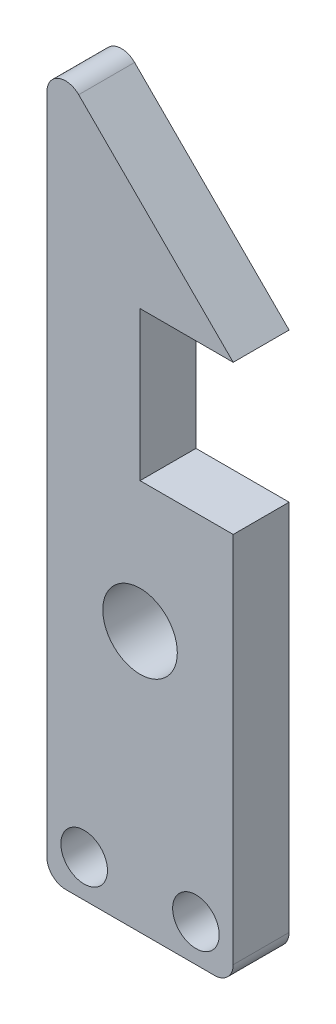
ISO-10303-21;
HEADER;
FILE_DESCRIPTION(('STEP AP214'),'2;1');
FILE_NAME('part.step','',(''),(''),'','','');
FILE_SCHEMA(('AUTOMOTIVE_DESIGN { 1 0 10303 214 1 1 1 1 }'));
ENDSEC;
DATA;
#1=APPLICATION_CONTEXT('core data for automotive mechanical design processes');
#2=APPLICATION_PROTOCOL_DEFINITION('international standard','automotive_design',2000,#1);
#3=PRODUCT_CONTEXT('',#1,'mechanical');
#4=PRODUCT('Part','Part','',(#3));
#5=PRODUCT_RELATED_PRODUCT_CATEGORY('part','',(#4));
#6=PRODUCT_DEFINITION_FORMATION('','',#4);
#7=PRODUCT_DEFINITION_CONTEXT('part definition',#1,'design');
#8=PRODUCT_DEFINITION('design','',#6,#7);
#9=PRODUCT_DEFINITION_SHAPE('','',#8);
#10=(LENGTH_UNIT() NAMED_UNIT(*) SI_UNIT(.MILLI.,.METRE.));
#11=(NAMED_UNIT(*) PLANE_ANGLE_UNIT() SI_UNIT($,.RADIAN.));
#12=(NAMED_UNIT(*) SI_UNIT($,.STERADIAN.) SOLID_ANGLE_UNIT());
#13=UNCERTAINTY_MEASURE_WITH_UNIT(LENGTH_MEASURE(1.E-05),#10,'distance_accuracy_value','');
#14=(GEOMETRIC_REPRESENTATION_CONTEXT(3) GLOBAL_UNCERTAINTY_ASSIGNED_CONTEXT((#13)) GLOBAL_UNIT_ASSIGNED_CONTEXT((#10,
#11,#12)) REPRESENTATION_CONTEXT('',''));
#15=CARTESIAN_POINT('',(0.,0.,0.));
#16=DIRECTION('',(0.,0.,1.));
#17=DIRECTION('',(1.,0.,0.));
#18=AXIS2_PLACEMENT_3D('',#15,#16,#17);
#19=CARTESIAN_POINT('',(0.,0.,3.));
#20=DIRECTION('',(0.,0.,-1.));
#21=DIRECTION('',(-1.,0.,0.));
#22=AXIS2_PLACEMENT_3D('',#19,#20,#21);
#23=PLANE('',#22);
#24=DIRECTION('',(-0.707106781186552,0.707106781186544,0.));
#25=VECTOR('',#24,1.);
#26=CARTESIAN_POINT('',(10.,29.,3.));
#27=LINE('',#26,#25);
#28=CARTESIAN_POINT('',(10.,29.,3.));
#29=VERTEX_POINT('',#28);
#30=CARTESIAN_POINT('',(1.70710678118654,37.2928932188134,3.));
#31=VERTEX_POINT('',#30);
#32=EDGE_CURVE('E141',#29,#31,#27,.T.);
#33=ORIENTED_EDGE('',*,*,#32,.T.);
#34=CARTESIAN_POINT('',(1.,36.5857864376268,3.));
#35=DIRECTION('',(0.,0.,-1.));
#36=DIRECTION('',(-1.,0.,0.));
#37=AXIS2_PLACEMENT_3D('',#34,#35,#36);
#38=CIRCLE('',#37,1.);
#39=CARTESIAN_POINT('',(0.,36.5857864376268,3.));
#40=VERTEX_POINT('',#39);
#41=EDGE_CURVE('E182',#31,#40,#38,.F.);
#42=ORIENTED_EDGE('',*,*,#41,.T.);
#43=DIRECTION('',(0.,-1.,0.));
#44=VECTOR('',#43,1.);
#45=CARTESIAN_POINT('',(0.,0.,3.));
#46=LINE('',#45,#44);
#47=CARTESIAN_POINT('',(0.,1.,3.));
#48=VERTEX_POINT('',#47);
#49=EDGE_CURVE('E160',#40,#48,#46,.T.);
#50=ORIENTED_EDGE('',*,*,#49,.T.);
#51=CARTESIAN_POINT('',(1.,1.,3.));
#52=DIRECTION('',(0.,0.,-1.));
#53=DIRECTION('',(-1.,0.,0.));
#54=AXIS2_PLACEMENT_3D('',#51,#52,#53);
#55=CIRCLE('',#54,1.);
#56=CARTESIAN_POINT('',(1.,0.,3.));
#57=VERTEX_POINT('',#56);
#58=EDGE_CURVE('E179',#48,#57,#55,.F.);
#59=ORIENTED_EDGE('',*,*,#58,.T.);
#60=DIRECTION('',(1.,0.,0.));
#61=VECTOR('',#60,1.);
#62=CARTESIAN_POINT('',(0.,0.,3.));
#63=LINE('',#62,#61);
#64=CARTESIAN_POINT('',(9.,0.,3.));
#65=VERTEX_POINT('',#64);
#66=EDGE_CURVE('E119',#57,#65,#63,.T.);
#67=ORIENTED_EDGE('',*,*,#66,.T.);
#68=CARTESIAN_POINT('',(9.,1.,3.));
#69=DIRECTION('',(0.,0.,-1.));
#70=DIRECTION('',(-1.,0.,0.));
#71=AXIS2_PLACEMENT_3D('',#68,#69,#70);
#72=CIRCLE('',#71,1.);
#73=CARTESIAN_POINT('',(10.,1.,3.));
#74=VERTEX_POINT('',#73);
#75=EDGE_CURVE('E50',#65,#74,#72,.F.);
#76=ORIENTED_EDGE('',*,*,#75,.T.);
#77=DIRECTION('',(0.,1.,0.));
#78=VECTOR('',#77,1.);
#79=CARTESIAN_POINT('',(10.,0.,3.));
#80=LINE('',#79,#78);
#81=CARTESIAN_POINT('',(10.,21.,3.));
#82=VERTEX_POINT('',#81);
#83=EDGE_CURVE('E109',#74,#82,#80,.T.);
#84=ORIENTED_EDGE('',*,*,#83,.T.);
#85=DIRECTION('',(-1.,0.,0.));
#86=VECTOR('',#85,1.);
#87=CARTESIAN_POINT('',(10.,21.,3.));
#88=LINE('',#87,#86);
#89=CARTESIAN_POINT('',(5.,21.,3.));
#90=VERTEX_POINT('',#89);
#91=EDGE_CURVE('E114',#82,#90,#88,.T.);
#92=ORIENTED_EDGE('',*,*,#91,.T.);
#93=DIRECTION('',(0.,1.,0.));
#94=VECTOR('',#93,1.);
#95=CARTESIAN_POINT('',(5.,21.,3.));
#96=LINE('',#95,#94);
#97=CARTESIAN_POINT('',(5.,29.,3.));
#98=VERTEX_POINT('',#97);
#99=EDGE_CURVE('E134',#90,#98,#96,.T.);
#100=ORIENTED_EDGE('',*,*,#99,.T.);
#101=DIRECTION('',(1.,0.,0.));
#102=VECTOR('',#101,1.);
#103=CARTESIAN_POINT('',(5.,29.,3.));
#104=LINE('',#103,#102);
#105=EDGE_CURVE('E136',#98,#29,#104,.T.);
#106=ORIENTED_EDGE('',*,*,#105,.T.);
#107=EDGE_LOOP('',(#33,#42,#50,#59,#67,#76,#84,#92,#100,#106));
#108=FACE_BOUND('',#107,.T.);
#109=CARTESIAN_POINT('',(5.,14.,3.));
#110=DIRECTION('',(0.,0.,1.));
#111=DIRECTION('',(1.,0.,0.));
#112=AXIS2_PLACEMENT_3D('',#109,#110,#111);
#113=CIRCLE('',#112,2.);
#114=CARTESIAN_POINT('',(7.,14.,3.));
#115=VERTEX_POINT('',#114);
#116=EDGE_CURVE('E148',#115,#115,#113,.T.);
#117=ORIENTED_EDGE('',*,*,#116,.F.);
#118=EDGE_LOOP('',(#117));
#119=FACE_BOUND('',#118,.T.);
#120=CARTESIAN_POINT('',(2.,2.,3.));
#121=DIRECTION('',(0.,0.,1.));
#122=DIRECTION('',(1.,0.,0.));
#123=AXIS2_PLACEMENT_3D('',#120,#121,#122);
#124=CIRCLE('',#123,1.25);
#125=CARTESIAN_POINT('',(3.25,2.,3.));
#126=VERTEX_POINT('',#125);
#127=EDGE_CURVE('E258',#126,#126,#124,.T.);
#128=ORIENTED_EDGE('',*,*,#127,.F.);
#129=EDGE_LOOP('',(#128));
#130=FACE_BOUND('',#129,.T.);
#131=CARTESIAN_POINT('',(8.,2.,3.));
#132=DIRECTION('',(0.,0.,1.));
#133=DIRECTION('',(1.,0.,0.));
#134=AXIS2_PLACEMENT_3D('',#131,#132,#133);
#135=CIRCLE('',#134,1.25);
#136=CARTESIAN_POINT('',(9.25,2.,3.));
#137=VERTEX_POINT('',#136);
#138=EDGE_CURVE('E264',#137,#137,#135,.T.);
#139=ORIENTED_EDGE('',*,*,#138,.F.);
#140=EDGE_LOOP('',(#139));
#141=FACE_BOUND('',#140,.T.);
#142=ADVANCED_FACE('F35',(#108,#119,#130,#141),#23,.F.);
#143=CARTESIAN_POINT('',(0.,0.,0.));
#144=DIRECTION('',(0.,0.,-1.));
#145=DIRECTION('',(-1.,0.,0.));
#146=AXIS2_PLACEMENT_3D('',#143,#144,#145);
#147=PLANE('',#146);
#148=CARTESIAN_POINT('',(2.,2.,0.));
#149=DIRECTION('',(0.,0.,1.));
#150=DIRECTION('',(1.,0.,0.));
#151=AXIS2_PLACEMENT_3D('',#148,#149,#150);
#152=CIRCLE('',#151,1.25);
#153=CARTESIAN_POINT('',(3.25,2.,0.));
#154=VERTEX_POINT('',#153);
#155=EDGE_CURVE('E261',#154,#154,#152,.T.);
#156=ORIENTED_EDGE('',*,*,#155,.T.);
#157=EDGE_LOOP('',(#156));
#158=FACE_BOUND('',#157,.T.);
#159=DIRECTION('',(0.,-1.,0.));
#160=VECTOR('',#159,1.);
#161=CARTESIAN_POINT('',(0.,0.,0.));
#162=LINE('',#161,#160);
#163=CARTESIAN_POINT('',(0.,36.5857864376268,0.));
#164=VERTEX_POINT('',#163);
#165=CARTESIAN_POINT('',(0.,1.,0.));
#166=VERTEX_POINT('',#165);
#167=EDGE_CURVE('E144',#164,#166,#162,.T.);
#168=ORIENTED_EDGE('',*,*,#167,.F.);
#169=CARTESIAN_POINT('',(1.,36.5857864376268,0.));
#170=DIRECTION('',(0.,0.,-1.));
#171=DIRECTION('',(-1.,0.,0.));
#172=AXIS2_PLACEMENT_3D('',#169,#170,#171);
#173=CIRCLE('',#172,1.);
#174=CARTESIAN_POINT('',(1.70710678118654,37.2928932188134,0.));
#175=VERTEX_POINT('',#174);
#176=EDGE_CURVE('E175',#164,#175,#173,.T.);
#177=ORIENTED_EDGE('',*,*,#176,.T.);
#178=DIRECTION('',(-0.707106781186552,0.707106781186544,0.));
#179=VECTOR('',#178,1.);
#180=CARTESIAN_POINT('',(10.,29.,0.));
#181=LINE('',#180,#179);
#182=CARTESIAN_POINT('',(10.,29.,0.));
#183=VERTEX_POINT('',#182);
#184=EDGE_CURVE('E157',#183,#175,#181,.T.);
#185=ORIENTED_EDGE('',*,*,#184,.F.);
#186=DIRECTION('',(1.,0.,0.));
#187=VECTOR('',#186,1.);
#188=CARTESIAN_POINT('',(5.,29.,0.));
#189=LINE('',#188,#187);
#190=CARTESIAN_POINT('',(5.,29.,0.));
#191=VERTEX_POINT('',#190);
#192=EDGE_CURVE('E155',#191,#183,#189,.T.);
#193=ORIENTED_EDGE('',*,*,#192,.F.);
#194=DIRECTION('',(0.,1.,0.));
#195=VECTOR('',#194,1.);
#196=CARTESIAN_POINT('',(5.,21.,0.));
#197=LINE('',#196,#195);
#198=CARTESIAN_POINT('',(5.,21.,0.));
#199=VERTEX_POINT('',#198);
#200=EDGE_CURVE('E153',#199,#191,#197,.T.);
#201=ORIENTED_EDGE('',*,*,#200,.F.);
#202=DIRECTION('',(-1.,0.,0.));
#203=VECTOR('',#202,1.);
#204=CARTESIAN_POINT('',(10.,21.,0.));
#205=LINE('',#204,#203);
#206=CARTESIAN_POINT('',(10.,21.,0.));
#207=VERTEX_POINT('',#206);
#208=EDGE_CURVE('E151',#207,#199,#205,.T.);
#209=ORIENTED_EDGE('',*,*,#208,.F.);
#210=DIRECTION('',(0.,1.,0.));
#211=VECTOR('',#210,1.);
#212=CARTESIAN_POINT('',(10.,0.,0.));
#213=LINE('',#212,#211);
#214=CARTESIAN_POINT('',(10.,1.,0.));
#215=VERTEX_POINT('',#214);
#216=EDGE_CURVE('E125',#215,#207,#213,.T.);
#217=ORIENTED_EDGE('',*,*,#216,.F.);
#218=CARTESIAN_POINT('',(9.,1.,0.));
#219=DIRECTION('',(0.,0.,-1.));
#220=DIRECTION('',(-1.,0.,0.));
#221=AXIS2_PLACEMENT_3D('',#218,#219,#220);
#222=CIRCLE('',#221,1.);
#223=CARTESIAN_POINT('',(9.,0.,0.));
#224=VERTEX_POINT('',#223);
#225=EDGE_CURVE('E173',#215,#224,#222,.T.);
#226=ORIENTED_EDGE('',*,*,#225,.T.);
#227=DIRECTION('',(1.,0.,0.));
#228=VECTOR('',#227,1.);
#229=CARTESIAN_POINT('',(0.,0.,0.));
#230=LINE('',#229,#228);
#231=CARTESIAN_POINT('',(1.,0.,0.));
#232=VERTEX_POINT('',#231);
#233=EDGE_CURVE('E147',#232,#224,#230,.T.);
#234=ORIENTED_EDGE('',*,*,#233,.F.);
#235=CARTESIAN_POINT('',(1.,1.,0.));
#236=DIRECTION('',(0.,0.,-1.));
#237=DIRECTION('',(-1.,0.,0.));
#238=AXIS2_PLACEMENT_3D('',#235,#236,#237);
#239=CIRCLE('',#238,1.);
#240=EDGE_CURVE('E171',#232,#166,#239,.T.);
#241=ORIENTED_EDGE('',*,*,#240,.T.);
#242=EDGE_LOOP('',(#168,#177,#185,#193,#201,#209,#217,#226,#234,#241));
#243=FACE_BOUND('',#242,.T.);
#244=CARTESIAN_POINT('',(5.,14.,0.));
#245=DIRECTION('',(0.,0.,1.));
#246=DIRECTION('',(1.,0.,0.));
#247=AXIS2_PLACEMENT_3D('',#244,#245,#246);
#248=CIRCLE('',#247,2.);
#249=CARTESIAN_POINT('',(7.,14.,0.));
#250=VERTEX_POINT('',#249);
#251=EDGE_CURVE('E255',#250,#250,#248,.T.);
#252=ORIENTED_EDGE('',*,*,#251,.T.);
#253=EDGE_LOOP('',(#252));
#254=FACE_BOUND('',#253,.T.);
#255=CARTESIAN_POINT('',(8.,2.,0.));
#256=DIRECTION('',(0.,0.,1.));
#257=DIRECTION('',(1.,0.,0.));
#258=AXIS2_PLACEMENT_3D('',#255,#256,#257);
#259=CIRCLE('',#258,1.25);
#260=CARTESIAN_POINT('',(9.25,2.,0.));
#261=VERTEX_POINT('',#260);
#262=EDGE_CURVE('E267',#261,#261,#259,.T.);
#263=ORIENTED_EDGE('',*,*,#262,.T.);
#264=EDGE_LOOP('',(#263));
#265=FACE_BOUND('',#264,.T.);
#266=ADVANCED_FACE('F193',(#158,#243,#254,#265),#147,.T.);
#267=CARTESIAN_POINT('',(0.,0.,3.));
#268=DIRECTION('',(1.,0.,0.));
#269=DIRECTION('',(0.,0.,-1.));
#270=AXIS2_PLACEMENT_3D('',#267,#268,#269);
#271=PLANE('',#270);
#272=ORIENTED_EDGE('',*,*,#49,.F.);
#273=DIRECTION('',(0.,0.,-1.));
#274=VECTOR('',#273,1.);
#275=CARTESIAN_POINT('',(0.,36.5857864376268,3.));
#276=LINE('',#275,#274);
#277=EDGE_CURVE('E168',#40,#164,#276,.T.);
#278=ORIENTED_EDGE('',*,*,#277,.T.);
#279=ORIENTED_EDGE('',*,*,#167,.T.);
#280=DIRECTION('',(0.,0.,-1.));
#281=VECTOR('',#280,1.);
#282=CARTESIAN_POINT('',(0.,1.,3.));
#283=LINE('',#282,#281);
#284=EDGE_CURVE('E128',#166,#48,#283,.F.);
#285=ORIENTED_EDGE('',*,*,#284,.T.);
#286=EDGE_LOOP('',(#272,#278,#279,#285));
#287=FACE_BOUND('',#286,.T.);
#288=ADVANCED_FACE('F211',(#287),#271,.F.);
#289=CARTESIAN_POINT('',(0.,0.,3.));
#290=DIRECTION('',(0.,1.,0.));
#291=DIRECTION('',(0.,0.,1.));
#292=AXIS2_PLACEMENT_3D('',#289,#290,#291);
#293=PLANE('',#292);
#294=ORIENTED_EDGE('',*,*,#233,.T.);
#295=DIRECTION('',(0.,0.,-1.));
#296=VECTOR('',#295,1.);
#297=CARTESIAN_POINT('',(9.,0.,3.));
#298=LINE('',#297,#296);
#299=EDGE_CURVE('E11',#224,#65,#298,.F.);
#300=ORIENTED_EDGE('',*,*,#299,.T.);
#301=ORIENTED_EDGE('',*,*,#66,.F.);
#302=DIRECTION('',(0.,0.,-1.));
#303=VECTOR('',#302,1.);
#304=CARTESIAN_POINT('',(1.,0.,3.));
#305=LINE('',#304,#303);
#306=EDGE_CURVE('E43',#57,#232,#305,.T.);
#307=ORIENTED_EDGE('',*,*,#306,.T.);
#308=EDGE_LOOP('',(#294,#300,#301,#307));
#309=FACE_BOUND('',#308,.T.);
#310=ADVANCED_FACE('F188',(#309),#293,.F.);
#311=CARTESIAN_POINT('',(10.,0.,3.));
#312=DIRECTION('',(-1.,0.,0.));
#313=DIRECTION('',(0.,0.,1.));
#314=AXIS2_PLACEMENT_3D('',#311,#312,#313);
#315=PLANE('',#314);
#316=ORIENTED_EDGE('',*,*,#83,.F.);
#317=DIRECTION('',(0.,0.,-1.));
#318=VECTOR('',#317,1.);
#319=CARTESIAN_POINT('',(10.,1.,3.));
#320=LINE('',#319,#318);
#321=EDGE_CURVE('E184',#74,#215,#320,.T.);
#322=ORIENTED_EDGE('',*,*,#321,.T.);
#323=ORIENTED_EDGE('',*,*,#216,.T.);
#324=DIRECTION('',(0.,0.,-1.));
#325=VECTOR('',#324,1.);
#326=CARTESIAN_POINT('',(10.,21.,3.));
#327=LINE('',#326,#325);
#328=EDGE_CURVE('E122',#82,#207,#327,.T.);
#329=ORIENTED_EDGE('',*,*,#328,.F.);
#330=EDGE_LOOP('',(#316,#322,#323,#329));
#331=FACE_BOUND('',#330,.T.);
#332=ADVANCED_FACE('F123',(#331),#315,.F.);
#333=CARTESIAN_POINT('',(10.,21.,3.));
#334=DIRECTION('',(0.,-1.,0.));
#335=DIRECTION('',(0.,0.,-1.));
#336=AXIS2_PLACEMENT_3D('',#333,#334,#335);
#337=PLANE('',#336);
#338=ORIENTED_EDGE('',*,*,#208,.T.);
#339=DIRECTION('',(0.,0.,-1.));
#340=VECTOR('',#339,1.);
#341=CARTESIAN_POINT('',(5.,21.,3.));
#342=LINE('',#341,#340);
#343=EDGE_CURVE('E129',#90,#199,#342,.T.);
#344=ORIENTED_EDGE('',*,*,#343,.F.);
#345=ORIENTED_EDGE('',*,*,#91,.F.);
#346=ORIENTED_EDGE('',*,*,#328,.T.);
#347=EDGE_LOOP('',(#338,#344,#345,#346));
#348=FACE_BOUND('',#347,.T.);
#349=ADVANCED_FACE('F131',(#348),#337,.F.);
#350=CARTESIAN_POINT('',(5.,21.,3.));
#351=DIRECTION('',(-1.,0.,0.));
#352=DIRECTION('',(0.,-1.,0.));
#353=AXIS2_PLACEMENT_3D('',#350,#351,#352);
#354=PLANE('',#353);
#355=ORIENTED_EDGE('',*,*,#200,.T.);
#356=DIRECTION('',(0.,0.,-1.));
#357=VECTOR('',#356,1.);
#358=CARTESIAN_POINT('',(5.,29.,3.));
#359=LINE('',#358,#357);
#360=EDGE_CURVE('E163',#98,#191,#359,.T.);
#361=ORIENTED_EDGE('',*,*,#360,.F.);
#362=ORIENTED_EDGE('',*,*,#99,.F.);
#363=ORIENTED_EDGE('',*,*,#343,.T.);
#364=EDGE_LOOP('',(#355,#361,#362,#363));
#365=FACE_BOUND('',#364,.T.);
#366=ADVANCED_FACE('F225',(#365),#354,.F.);
#367=CARTESIAN_POINT('',(5.,29.,3.));
#368=DIRECTION('',(0.,1.,0.));
#369=DIRECTION('',(0.,0.,1.));
#370=AXIS2_PLACEMENT_3D('',#367,#368,#369);
#371=PLANE('',#370);
#372=ORIENTED_EDGE('',*,*,#192,.T.);
#373=DIRECTION('',(0.,0.,-1.));
#374=VECTOR('',#373,1.);
#375=CARTESIAN_POINT('',(10.,29.,3.));
#376=LINE('',#375,#374);
#377=EDGE_CURVE('E143',#29,#183,#376,.T.);
#378=ORIENTED_EDGE('',*,*,#377,.F.);
#379=ORIENTED_EDGE('',*,*,#105,.F.);
#380=ORIENTED_EDGE('',*,*,#360,.T.);
#381=EDGE_LOOP('',(#372,#378,#379,#380));
#382=FACE_BOUND('',#381,.T.);
#383=ADVANCED_FACE('F221',(#382),#371,.F.);
#384=CARTESIAN_POINT('',(10.,29.,3.));
#385=DIRECTION('',(-0.707106781186544,-0.707106781186551,0.));
#386=DIRECTION('',(0.707106781186551,-0.707106781186544,0.));
#387=AXIS2_PLACEMENT_3D('',#384,#385,#386);
#388=PLANE('',#387);
#389=ORIENTED_EDGE('',*,*,#184,.T.);
#390=DIRECTION('',(0.,0.,-1.));
#391=VECTOR('',#390,1.);
#392=CARTESIAN_POINT('',(1.70710678118654,37.2928932188134,3.));
#393=LINE('',#392,#391);
#394=EDGE_CURVE('E177',#175,#31,#393,.F.);
#395=ORIENTED_EDGE('',*,*,#394,.T.);
#396=ORIENTED_EDGE('',*,*,#32,.F.);
#397=ORIENTED_EDGE('',*,*,#377,.T.);
#398=EDGE_LOOP('',(#389,#395,#396,#397));
#399=FACE_BOUND('',#398,.T.);
#400=ADVANCED_FACE('F218',(#399),#388,.F.);
#401=CARTESIAN_POINT('',(5.,14.,3.));
#402=DIRECTION('',(0.,0.,-1.));
#403=DIRECTION('',(-1.,0.,0.));
#404=AXIS2_PLACEMENT_3D('',#401,#402,#403);
#405=CYLINDRICAL_SURFACE('',#404,2.);
#406=ORIENTED_EDGE('',*,*,#116,.T.);
#407=EDGE_LOOP('',(#406));
#408=FACE_BOUND('',#407,.T.);
#409=ORIENTED_EDGE('',*,*,#251,.F.);
#410=EDGE_LOOP('',(#409));
#411=FACE_BOUND('',#410,.T.);
#412=ADVANCED_FACE('F215',(#408,#411),#405,.F.);
#413=CARTESIAN_POINT('',(2.,2.,3.));
#414=DIRECTION('',(0.,0.,-1.));
#415=DIRECTION('',(-1.,0.,0.));
#416=AXIS2_PLACEMENT_3D('',#413,#414,#415);
#417=CYLINDRICAL_SURFACE('',#416,1.25);
#418=ORIENTED_EDGE('',*,*,#127,.T.);
#419=EDGE_LOOP('',(#418));
#420=FACE_BOUND('',#419,.T.);
#421=ORIENTED_EDGE('',*,*,#155,.F.);
#422=EDGE_LOOP('',(#421));
#423=FACE_BOUND('',#422,.T.);
#424=ADVANCED_FACE('F276',(#420,#423),#417,.F.);
#425=CARTESIAN_POINT('',(8.,2.,3.));
#426=DIRECTION('',(0.,0.,-1.));
#427=DIRECTION('',(-1.,0.,0.));
#428=AXIS2_PLACEMENT_3D('',#425,#426,#427);
#429=CYLINDRICAL_SURFACE('',#428,1.25);
#430=ORIENTED_EDGE('',*,*,#138,.T.);
#431=EDGE_LOOP('',(#430));
#432=FACE_BOUND('',#431,.T.);
#433=ORIENTED_EDGE('',*,*,#262,.F.);
#434=EDGE_LOOP('',(#433));
#435=FACE_BOUND('',#434,.T.);
#436=ADVANCED_FACE('F203',(#432,#435),#429,.F.);
#437=CARTESIAN_POINT('',(1.,36.5857864376268,3.));
#438=DIRECTION('',(0.,0.,-1.));
#439=DIRECTION('',(-1.,0.,0.));
#440=AXIS2_PLACEMENT_3D('',#437,#438,#439);
#441=CYLINDRICAL_SURFACE('',#440,1.);
#442=ORIENTED_EDGE('',*,*,#41,.F.);
#443=ORIENTED_EDGE('',*,*,#394,.F.);
#444=ORIENTED_EDGE('',*,*,#176,.F.);
#445=ORIENTED_EDGE('',*,*,#277,.F.);
#446=EDGE_LOOP('',(#442,#443,#444,#445));
#447=FACE_BOUND('',#446,.T.);
#448=ADVANCED_FACE('F198',(#447),#441,.T.);
#449=CARTESIAN_POINT('',(9.,1.,3.));
#450=DIRECTION('',(0.,0.,-1.));
#451=DIRECTION('',(-1.,0.,0.));
#452=AXIS2_PLACEMENT_3D('',#449,#450,#451);
#453=CYLINDRICAL_SURFACE('',#452,1.);
#454=ORIENTED_EDGE('',*,*,#75,.F.);
#455=ORIENTED_EDGE('',*,*,#299,.F.);
#456=ORIENTED_EDGE('',*,*,#225,.F.);
#457=ORIENTED_EDGE('',*,*,#321,.F.);
#458=EDGE_LOOP('',(#454,#455,#456,#457));
#459=FACE_BOUND('',#458,.T.);
#460=ADVANCED_FACE('F196',(#459),#453,.T.);
#461=CARTESIAN_POINT('',(1.,1.,3.));
#462=DIRECTION('',(0.,0.,-1.));
#463=DIRECTION('',(-1.,0.,0.));
#464=AXIS2_PLACEMENT_3D('',#461,#462,#463);
#465=CYLINDRICAL_SURFACE('',#464,1.);
#466=ORIENTED_EDGE('',*,*,#58,.F.);
#467=ORIENTED_EDGE('',*,*,#284,.F.);
#468=ORIENTED_EDGE('',*,*,#240,.F.);
#469=ORIENTED_EDGE('',*,*,#306,.F.);
#470=EDGE_LOOP('',(#466,#467,#468,#469));
#471=FACE_BOUND('',#470,.T.);
#472=ADVANCED_FACE('F37',(#471),#465,.T.);
#473=CLOSED_SHELL('',(#142,#266,#288,#310,#332,#349,#366,#383,#400,#412,#424,#436,#448,#460,#472));
#474=MANIFOLD_SOLID_BREP('B2',#473);
#475=ADVANCED_BREP_SHAPE_REPRESENTATION('',(#18,#474),#14);
#476=SHAPE_DEFINITION_REPRESENTATION(#9,#475);
ENDSEC;
END-ISO-10303-21;
